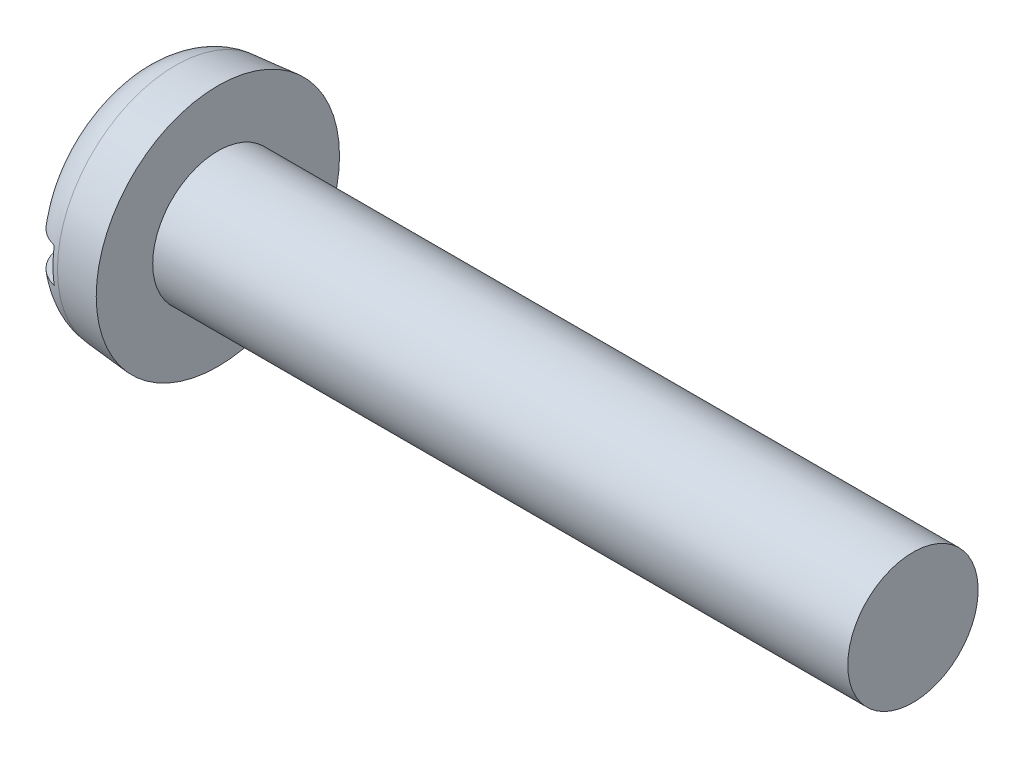
ISO-10303-21;
HEADER;
FILE_DESCRIPTION(('STEP AP214'),'2;1');
FILE_NAME('part.step','',(''),(''),'','','');
FILE_SCHEMA(('AUTOMOTIVE_DESIGN { 1 0 10303 214 1 1 1 1 }'));
ENDSEC;
DATA;
#1=APPLICATION_CONTEXT('core data for automotive mechanical design processes');
#2=APPLICATION_PROTOCOL_DEFINITION('international standard','automotive_design',2000,#1);
#3=PRODUCT_CONTEXT('',#1,'mechanical');
#4=PRODUCT('Part','Part','',(#3));
#5=PRODUCT_RELATED_PRODUCT_CATEGORY('part','',(#4));
#6=PRODUCT_DEFINITION_FORMATION('','',#4);
#7=PRODUCT_DEFINITION_CONTEXT('part definition',#1,'design');
#8=PRODUCT_DEFINITION('design','',#6,#7);
#9=PRODUCT_DEFINITION_SHAPE('','',#8);
#10=(LENGTH_UNIT() NAMED_UNIT(*) SI_UNIT(.MILLI.,.METRE.));
#11=(NAMED_UNIT(*) PLANE_ANGLE_UNIT() SI_UNIT($,.RADIAN.));
#12=(NAMED_UNIT(*) SI_UNIT($,.STERADIAN.) SOLID_ANGLE_UNIT());
#13=UNCERTAINTY_MEASURE_WITH_UNIT(LENGTH_MEASURE(1.E-05),#10,'distance_accuracy_value','');
#14=(GEOMETRIC_REPRESENTATION_CONTEXT(3) GLOBAL_UNCERTAINTY_ASSIGNED_CONTEXT((#13)) GLOBAL_UNIT_ASSIGNED_CONTEXT((#10,
#11,#12)) REPRESENTATION_CONTEXT('',''));
#15=CARTESIAN_POINT('',(0.,0.,0.));
#16=DIRECTION('',(0.,0.,1.));
#17=DIRECTION('',(1.,0.,0.));
#18=AXIS2_PLACEMENT_3D('',#15,#16,#17);
#19=CARTESIAN_POINT('',(0.,0.,0.));
#20=DIRECTION('',(-1.,0.,0.));
#21=DIRECTION('',(0.,0.,1.));
#22=AXIS2_PLACEMENT_3D('',#19,#20,#21);
#23=PLANE('',#22);
#24=DIRECTION('',(0.,0.,-1.));
#25=VECTOR('',#24,1.);
#26=CARTESIAN_POINT('',(0.,0.4,2.8));
#27=LINE('',#26,#25);
#28=CARTESIAN_POINT('',(0.,0.4,1.77326763142532));
#29=VERTEX_POINT('',#28);
#30=CARTESIAN_POINT('',(0.,0.4,-1.77326763142532));
#31=VERTEX_POINT('',#30);
#32=EDGE_CURVE('E88',#29,#31,#27,.T.);
#33=ORIENTED_EDGE('',*,*,#32,.F.);
#34=CARTESIAN_POINT('',(0.,0.,0.));
#35=DIRECTION('',(-1.,0.,0.));
#36=DIRECTION('',(0.,0.,1.));
#37=AXIS2_PLACEMENT_3D('',#34,#35,#36);
#38=CIRCLE('',#37,1.81782234903766);
#39=EDGE_CURVE('E94',#29,#31,#38,.T.);
#40=ORIENTED_EDGE('',*,*,#39,.T.);
#41=EDGE_LOOP('',(#33,#40));
#42=FACE_BOUND('',#41,.T.);
#43=ADVANCED_FACE('F35',(#42),#23,.T.);
#44=CARTESIAN_POINT('',(-25.4,0.,0.));
#45=DIRECTION('',(-1.,0.,0.));
#46=DIRECTION('',(0.,0.,1.));
#47=AXIS2_PLACEMENT_3D('',#44,#45,#46);
#48=CYLINDRICAL_SURFACE('',#47,1.5);
#49=CARTESIAN_POINT('',(17.8,0.,0.));
#50=DIRECTION('',(-1.,0.,0.));
#51=DIRECTION('',(0.,0.,1.));
#52=AXIS2_PLACEMENT_3D('',#49,#50,#51);
#53=CIRCLE('',#52,1.5);
#54=CARTESIAN_POINT('',(17.8,0.,1.5));
#55=VERTEX_POINT('',#54);
#56=EDGE_CURVE('E95',#55,#55,#53,.T.);
#57=ORIENTED_EDGE('',*,*,#56,.T.);
#58=EDGE_LOOP('',(#57));
#59=FACE_BOUND('',#58,.T.);
#60=CARTESIAN_POINT('',(1.8,0.,0.));
#61=DIRECTION('',(-1.,0.,0.));
#62=DIRECTION('',(0.,0.,1.));
#63=AXIS2_PLACEMENT_3D('',#60,#61,#62);
#64=CIRCLE('',#63,1.5);
#65=CARTESIAN_POINT('',(1.8,0.,1.5));
#66=VERTEX_POINT('',#65);
#67=EDGE_CURVE('E152',#66,#66,#64,.T.);
#68=ORIENTED_EDGE('',*,*,#67,.F.);
#69=EDGE_LOOP('',(#68));
#70=FACE_BOUND('',#69,.T.);
#71=ADVANCED_FACE('F140',(#59,#70),#48,.T.);
#72=CARTESIAN_POINT('',(17.8,1.5,0.));
#73=DIRECTION('',(1.,0.,0.));
#74=DIRECTION('',(0.,0.,-1.));
#75=AXIS2_PLACEMENT_3D('',#72,#73,#74);
#76=PLANE('',#75);
#77=ORIENTED_EDGE('',*,*,#56,.F.);
#78=EDGE_LOOP('',(#77));
#79=FACE_BOUND('',#78,.T.);
#80=ADVANCED_FACE('F138',(#79),#76,.T.);
#81=DIRECTION('',(0.,0.,1.));
#82=VECTOR('',#81,1.);
#83=CARTESIAN_POINT('',(0.,-0.4,-2.8));
#84=LINE('',#83,#82);
#85=CARTESIAN_POINT('',(0.,-0.4,-1.77326763142532));
#86=VERTEX_POINT('',#85);
#87=CARTESIAN_POINT('',(0.,-0.4,1.77326763142532));
#88=VERTEX_POINT('',#87);
#89=EDGE_CURVE('E79',#86,#88,#84,.T.);
#90=ORIENTED_EDGE('',*,*,#89,.F.);
#91=EDGE_CURVE('E86',#86,#88,#38,.T.);
#92=ORIENTED_EDGE('',*,*,#91,.T.);
#93=EDGE_LOOP('',(#90,#92));
#94=FACE_BOUND('',#93,.T.);
#95=ADVANCED_FACE('F85',(#94),#23,.T.);
#96=CARTESIAN_POINT('',(0.,0.,0.));
#97=DIRECTION('',(1.,0.,0.));
#98=DIRECTION('',(0.,0.,-1.));
#99=AXIS2_PLACEMENT_3D('',#96,#97,#98);
#100=CONICAL_SURFACE('',#99,2.64252040565334,0.0872664625997168);
#101=CARTESIAN_POINT('',(0.821559831527111,0.,0.));
#102=DIRECTION('',(-1.,0.,0.));
#103=DIRECTION('',(0.,0.,1.));
#104=AXIS2_PLACEMENT_3D('',#101,#102,#103);
#105=CIRCLE('',#104,2.71439757732023);
#106=CARTESIAN_POINT('',(0.821559831527111,0.,2.71439757732023));
#107=VERTEX_POINT('',#106);
#108=EDGE_CURVE('E98',#107,#107,#105,.F.);
#109=ORIENTED_EDGE('',*,*,#108,.T.);
#110=EDGE_LOOP('',(#109));
#111=FACE_BOUND('',#110,.T.);
#112=CARTESIAN_POINT('',(1.8,0.,0.));
#113=DIRECTION('',(-1.,0.,0.));
#114=DIRECTION('',(0.,0.,1.));
#115=AXIS2_PLACEMENT_3D('',#112,#113,#114);
#116=CIRCLE('',#115,2.8);
#117=CARTESIAN_POINT('',(1.8,0.,2.8));
#118=VERTEX_POINT('',#117);
#119=EDGE_CURVE('E100',#118,#118,#116,.T.);
#120=ORIENTED_EDGE('',*,*,#119,.T.);
#121=EDGE_LOOP('',(#120));
#122=FACE_BOUND('',#121,.T.);
#123=ADVANCED_FACE('F131',(#111,#122),#100,.T.);
#124=CARTESIAN_POINT('',(1.8,1.5,0.));
#125=DIRECTION('',(-1.,0.,0.));
#126=DIRECTION('',(0.,0.,1.));
#127=AXIS2_PLACEMENT_3D('',#124,#125,#126);
#128=PLANE('',#127);
#129=ORIENTED_EDGE('',*,*,#119,.F.);
#130=EDGE_LOOP('',(#129));
#131=FACE_BOUND('',#130,.T.);
#132=ORIENTED_EDGE('',*,*,#67,.T.);
#133=EDGE_LOOP('',(#132));
#134=FACE_BOUND('',#133,.T.);
#135=ADVANCED_FACE('F127',(#131,#134),#128,.F.);
#136=CARTESIAN_POINT('',(0.9,0.,0.));
#137=DIRECTION('',(-1.,0.,0.));
#138=DIRECTION('',(0.,0.,1.));
#139=AXIS2_PLACEMENT_3D('',#136,#137,#138);
#140=TOROIDAL_SURFACE('',#139,1.81782234903766,0.9);
#141=CARTESIAN_POINT('',(0.401696093511728,0.4,-2.53593152114129));
#142=CARTESIAN_POINT('',(0.443301117774009,0.4,-2.56393332788218));
#143=CARTESIAN_POINT('',(0.48728921147468,0.4,-2.58845843023252));
#144=CARTESIAN_POINT('',(0.578792425576941,0.4,-2.62980192456992));
#145=CARTESIAN_POINT('',(0.626311517541325,0.4,-2.64661148109401));
#146=CARTESIAN_POINT('',(0.723491694345221,0.4,-2.67199528317045));
#147=CARTESIAN_POINT('',(0.77315217005018,0.4,-2.6805718547261));
#148=CARTESIAN_POINT('',(0.873195470603058,0.4,-2.68923740018578));
#149=CARTESIAN_POINT('',(0.923578118909892,0.4,-2.68932841422142));
#150=CARTESIAN_POINT('',(1.02350797374872,0.4,-2.68103738118982));
#151=CARTESIAN_POINT('',(1.07305702227845,0.4,-2.67267751789981));
#152=CARTESIAN_POINT('',(1.17005159771854,0.4,-2.64776531442094));
#153=CARTESIAN_POINT('',(1.21749706154432,0.4,-2.63121272872072));
#154=CARTESIAN_POINT('',(1.30899463227735,0.4,-2.59038229907007));
#155=CARTESIAN_POINT('',(1.35304326494453,0.4,-2.5660966726896));
#156=CARTESIAN_POINT('',(1.43646971838795,0.4,-2.51051742624853));
#157=CARTESIAN_POINT('',(1.47584746170715,0.4,-2.47922368999777));
#158=CARTESIAN_POINT('',(1.54908472891299,0.4,-2.41032419236434));
#159=CARTESIAN_POINT('',(1.58290894495081,0.4,-2.37268091273685));
#160=CARTESIAN_POINT('',(1.64384285536696,0.4,-2.29230689336045));
#161=CARTESIAN_POINT('',(1.67095227126419,0.4,-2.24957594272072));
#162=CARTESIAN_POINT('',(1.71804431058735,0.4,-2.15971237578418));
#163=CARTESIAN_POINT('',(1.73793948776457,0.4,-2.11253395536871));
#164=CARTESIAN_POINT('',(1.76968090770725,0.4,-2.01554593245493));
#165=CARTESIAN_POINT('',(1.78152655521718,0.4,-1.96573613566218));
#166=CARTESIAN_POINT('',(1.79707863209083,0.4,-1.86394560462762));
#167=CARTESIAN_POINT('',(1.80063474217523,0.4,-1.81194193297292));
#168=CARTESIAN_POINT('',(1.79917918253395,0.4,-1.70805700113295));
#169=CARTESIAN_POINT('',(1.79416652473772,0.4,-1.65617575575555));
#170=CARTESIAN_POINT('',(1.7755943642346,0.4,-1.55269446133053));
#171=CARTESIAN_POINT('',(1.76183474132893,0.4,-1.50113034177219));
#172=CARTESIAN_POINT('',(1.72605722331735,0.4,-1.40095096381718));
#173=CARTESIAN_POINT('',(1.70403814128862,0.4,-1.35233613041373));
#174=CARTESIAN_POINT('',(1.65177086981811,0.4,-1.25824022538735));
#175=CARTESIAN_POINT('',(1.62134113345016,0.4,-1.21285988807693));
#176=CARTESIAN_POINT('',(1.55331109595649,0.4,-1.12780932458797));
#177=CARTESIAN_POINT('',(1.51570875984687,0.4,-1.08814072454133));
#178=CARTESIAN_POINT('',(1.43418773757712,0.4,-1.01571120097083));
#179=CARTESIAN_POINT('',(1.39025557046043,0.4,-0.982965398150426));
#180=CARTESIAN_POINT('',(1.29725173640542,0.4,-0.925820211344956));
#181=CARTESIAN_POINT('',(1.24818246394632,0.4,-0.901416961201436));
#182=CARTESIAN_POINT('',(1.1492196326343,0.4,-0.863395366502829));
#183=CARTESIAN_POINT('',(1.09953332116632,0.4,-0.849240526280142));
#184=CARTESIAN_POINT('',(0.998407326739823,0.4,-0.830450847570662));
#185=CARTESIAN_POINT('',(0.946969290105793,0.4,-0.825807308120568));
#186=CARTESIAN_POINT('',(0.84892872096548,0.4,-0.826338661096803));
#187=CARTESIAN_POINT('',(0.802319233875119,0.4,-0.830644672645143));
#188=CARTESIAN_POINT('',(0.710503550748047,0.4,-0.847082675101284));
#189=CARTESIAN_POINT('',(0.665297586491216,0.4,-0.859215951485934));
#190=CARTESIAN_POINT('',(0.577725921687515,0.4,-0.890561229701253));
#191=CARTESIAN_POINT('',(0.535345451357801,0.4,-0.909732336345551));
#192=CARTESIAN_POINT('',(0.454039585142496,0.4,-0.954356114786257));
#193=CARTESIAN_POINT('',(0.415115190169609,0.4,-0.979810598293163));
#194=CARTESIAN_POINT('',(0.338258283652574,0.4,-1.03863563377017));
#195=CARTESIAN_POINT('',(0.300704584388947,0.4,-1.07250127234658));
#196=CARTESIAN_POINT('',(0.231340396591253,0.4,-1.14567873524743));
#197=CARTESIAN_POINT('',(0.199531837361427,0.4,-1.1849923812911));
#198=CARTESIAN_POINT('',(0.140343537062657,0.4,-1.27100479329441));
#199=CARTESIAN_POINT('',(0.113435239263175,0.4,-1.31802904125808));
#200=CARTESIAN_POINT('',(0.0677697881199934,0.4,-1.41588613859262));
#201=CARTESIAN_POINT('',(0.0490135480549559,0.4,-1.466719413943));
#202=CARTESIAN_POINT('',(0.0200605085740848,0.4,-1.57150752749652));
#203=CARTESIAN_POINT('',(0.00998112078324489,0.4,-1.62549494001755));
#204=CARTESIAN_POINT('',(-0.000774459474645484,0.4,-1.73439964710515));
#205=CARTESIAN_POINT('',(-0.00145178031293717,0.4,-1.78931682929512));
#206=CARTESIAN_POINT('',(0.00665978805998371,0.4,-1.8973585349181));
#207=CARTESIAN_POINT('',(0.0152619165789972,0.4,-1.95049703954292));
#208=CARTESIAN_POINT('',(0.0415044362784365,0.4,-2.05451158025993));
#209=CARTESIAN_POINT('',(0.0591459771853456,0.4,-2.10538732765632));
#210=CARTESIAN_POINT('',(0.102479617855353,0.4,-2.20207106255329));
#211=CARTESIAN_POINT('',(0.127962009730159,0.4,-2.24797321246302));
#212=CARTESIAN_POINT('',(0.186405952526769,0.4,-2.3346826673761));
#213=CARTESIAN_POINT('',(0.219357119954585,0.4,-2.37549692488183));
#214=CARTESIAN_POINT('',(0.2776517991716,0.4,-2.43611780517026));
#215=CARTESIAN_POINT('',(0.300961246504243,0.4,-2.45791602542563));
#216=CARTESIAN_POINT('',(0.349758108963351,0.4,-2.49892172941219));
#217=CARTESIAN_POINT('',(0.375245501851939,0.4,-2.51812923959063));
#218=CARTESIAN_POINT('',(0.401696093511728,0.4,-2.53593152114129));
#219=B_SPLINE_CURVE_WITH_KNOTS('',3,(#141,#142,#143,#144,#145,#146,#147,#148,#149,#150,#151,
#152,#153,#154,#155,#156,#157,#158,#159,#160,#161,#162,#163,#164,#165,#166,#167,#168,#169,#170,
#171,#172,#173,#174,#175,#176,#177,#178,#179,#180,#181,#182,#183,#184,#185,#186,#187,#188,#189,
#190,#191,#192,#193,#194,#195,#196,#197,#198,#199,#200,#201,#202,#203,#204,#205,#206,#207,#208,
#209,#210,#211,#212,#213,#214,#215,#216,#217,#218),.UNSPECIFIED.,.T.,.F.,(4,2,2,2,2,2,2,2,2,2,2,
2,2,2,2,2,2,2,2,2,2,2,2,2,2,2,2,2,2,2,2,2,2,2,2,2,2,2,4),(0.,0.150335933494514,
0.300843597394242,0.451308726970357,0.601737681026104,0.751772777865598,0.901812371080131,
1.05200344195132,1.20219700308282,1.35331128753966,1.50443183806961,1.65732734739064,
1.81023416196794,1.96589285940572,2.1215695071664,2.28094272743601,2.44033885916066,
2.60348795607714,2.76668341009569,2.93023171311279,3.09370412047096,3.24783730341248,
3.40182942181944,3.5415702699926,3.68133407374162,3.82029827564248,3.95930259253055,
4.11036263383425,4.26147330942957,4.42325618279747,4.58505717610391,4.74901464634026,
4.9129524393615,5.07365129317271,5.23437059141101,5.39111839087745,5.54764959339694,
5.64322735248863,5.73880413580184),.UNSPECIFIED.);
#220=CARTESIAN_POINT('',(0.7,0.4,-2.66547244738019));
#221=VERTEX_POINT('',#220);
#222=EDGE_CURVE('E11',#31,#221,#219,.T.);
#223=ORIENTED_EDGE('',*,*,#222,.F.);
#224=ORIENTED_EDGE('',*,*,#39,.F.);
#225=CARTESIAN_POINT('',(0.631175220468883,0.4,0.871495981540627));
#226=CARTESIAN_POINT('',(0.674904543341188,0.4,0.856438796500031));
#227=CARTESIAN_POINT('',(0.719878263159747,0.4,0.844929838444239));
#228=CARTESIAN_POINT('',(0.811135722097473,0.4,0.829645582358335));
#229=CARTESIAN_POINT('',(0.857419653490011,0.4,0.82587142543657));
#230=CARTESIAN_POINT('',(0.949967657712768,0.4,0.826292946243278));
#231=CARTESIAN_POINT('',(0.996231718998188,0.4,0.830491246695725));
#232=CARTESIAN_POINT('',(1.08739120729822,0.4,0.846603737630664));
#233=CARTESIAN_POINT('',(1.13228633060722,0.4,0.858519627443414));
#234=CARTESIAN_POINT('',(1.21961165117638,0.4,0.889449471124122));
#235=CARTESIAN_POINT('',(1.26203829733493,0.4,0.908473372222466));
#236=CARTESIAN_POINT('',(1.34345634110222,0.4,0.952815473313927));
#237=CARTESIAN_POINT('',(1.38244667242382,0.4,0.978135617780085));
#238=CARTESIAN_POINT('',(1.4594377621541,0.4,1.03667706350997));
#239=CARTESIAN_POINT('',(1.49706398720202,0.4,1.07039108297028));
#240=CARTESIAN_POINT('',(1.56659895295035,0.4,1.14327535241885));
#241=CARTESIAN_POINT('',(1.59850581805068,0.4,1.18244738484377));
#242=CARTESIAN_POINT('',(1.65794109406934,0.4,1.26820361081833));
#243=CARTESIAN_POINT('',(1.68499616118368,0.4,1.31511693869777));
#244=CARTESIAN_POINT('',(1.73097615311023,0.4,1.41277630231542));
#245=CARTESIAN_POINT('',(1.74990014079754,0.4,1.46352277904048));
#246=CARTESIAN_POINT('',(1.77921631303595,0.4,1.56819037296415));
#247=CARTESIAN_POINT('',(1.78948692404479,0.4,1.62214568122431));
#248=CARTESIAN_POINT('',(1.80062989577949,0.4,1.73102148257415));
#249=CARTESIAN_POINT('',(1.80150300404476,0.4,1.78594189854469));
#250=CARTESIAN_POINT('',(1.79377570144154,0.4,1.89403950300678));
#251=CARTESIAN_POINT('',(1.78535947623962,0.4,1.94722981003804));
#252=CARTESIAN_POINT('',(1.75948035152466,0.4,2.05136420293336));
#253=CARTESIAN_POINT('',(1.74201866082191,0.4,2.10230858794919));
#254=CARTESIAN_POINT('',(1.69903294428936,0.4,2.1991365537311));
#255=CARTESIAN_POINT('',(1.67372338322898,0.4,2.24511537218269));
#256=CARTESIAN_POINT('',(1.61559302758182,0.4,2.33205182310155));
#257=CARTESIAN_POINT('',(1.58277310246186,0.4,2.37301003595672));
#258=CARTESIAN_POINT('',(1.51127974813898,0.4,2.44787841079591));
#259=CARTESIAN_POINT('',(1.47273752290481,0.4,2.48191390856888));
#260=CARTESIAN_POINT('',(1.39041996071933,0.4,2.54292499319193));
#261=CARTESIAN_POINT('',(1.34664504043414,0.4,2.5699011416151));
#262=CARTESIAN_POINT('',(1.25574182443869,0.4,2.61566191750627));
#263=CARTESIAN_POINT('',(1.20866632391598,0.4,2.63455146707593));
#264=CARTESIAN_POINT('',(1.11199802813735,0.4,2.66409285611721));
#265=CARTESIAN_POINT('',(1.06240535215686,0.4,2.67474508552361));
#266=CARTESIAN_POINT('',(0.962502526653357,0.4,2.68744471269732));
#267=CARTESIAN_POINT('',(0.912200346253432,0.4,2.68955487726819));
#268=CARTESIAN_POINT('',(0.811958811975336,0.4,2.68528081529453));
#269=CARTESIAN_POINT('',(0.762019450666034,0.4,2.67889676322146));
#270=CARTESIAN_POINT('',(0.664027531989639,0.4,2.65784627208927));
#271=CARTESIAN_POINT('',(0.615971279375599,0.4,2.643197022474));
#272=CARTESIAN_POINT('',(0.522990210676872,0.4,2.60606123058607));
#273=CARTESIAN_POINT('',(0.478065406672589,0.4,2.58357465808084));
#274=CARTESIAN_POINT('',(0.392472109536808,0.4,2.53134616302211));
#275=CARTESIAN_POINT('',(0.351816515703728,0.4,2.50158310815031));
#276=CARTESIAN_POINT('',(0.276029509997113,0.4,2.4357048513604));
#277=CARTESIAN_POINT('',(0.240898244430083,0.4,2.39958948126101));
#278=CARTESIAN_POINT('',(0.176835333350468,0.4,2.32172709740984));
#279=CARTESIAN_POINT('',(0.147956836829552,0.4,2.27993636985612));
#280=CARTESIAN_POINT('',(0.0975151321071609,0.4,2.19215427977415));
#281=CARTESIAN_POINT('',(0.0759523258739369,0.4,2.14616268660111));
#282=CARTESIAN_POINT('',(0.0404117526562702,0.4,2.05060031814039));
#283=CARTESIAN_POINT('',(0.0265449840419457,0.4,2.00098828619734));
#284=CARTESIAN_POINT('',(0.00715737687929584,0.4,1.90016214005584));
#285=CARTESIAN_POINT('',(0.00163730520276083,0.4,1.84894787909014));
#286=CARTESIAN_POINT('',(-0.00103646856464831,0.4,1.74525626284435));
#287=CARTESIAN_POINT('',(0.00198298502720431,0.4,1.692774471539));
#288=CARTESIAN_POINT('',(0.0165672576861163,0.4,1.5890162459782));
#289=CARTESIAN_POINT('',(0.0281327748436754,0.4,1.53773991054426));
#290=CARTESIAN_POINT('',(0.0597928723844844,0.4,1.43649219995258));
#291=CARTESIAN_POINT('',(0.0800919231210289,0.4,1.3865847552086));
#292=CARTESIAN_POINT('',(0.128628670781471,0.4,1.29076759544655));
#293=CARTESIAN_POINT('',(0.156870001205797,0.4,1.2448597228063));
#294=CARTESIAN_POINT('',(0.221149361739103,0.4,1.15746425330815));
#295=CARTESIAN_POINT('',(0.257329693538453,0.4,1.11608124200677));
#296=CARTESIAN_POINT('',(0.33619903186313,0.4,1.04011285475969));
#297=CARTESIAN_POINT('',(0.378880772489415,0.4,1.00551998779309));
#298=CARTESIAN_POINT('',(0.456345744826249,0.4,0.953377181098868));
#299=CARTESIAN_POINT('',(0.489781510585734,0.4,0.933802963989649));
#300=CARTESIAN_POINT('',(0.558913558209207,0.4,0.899158166013482));
#301=CARTESIAN_POINT('',(0.594609343085406,0.4,0.884086599134742));
#302=CARTESIAN_POINT('',(0.631175220468883,0.4,0.871495981540627));
#303=B_SPLINE_CURVE_WITH_KNOTS('',3,(#225,#226,#227,#228,#229,#230,#231,#232,#233,#234,#235,
#236,#237,#238,#239,#240,#241,#242,#243,#244,#245,#246,#247,#248,#249,#250,#251,#252,#253,#254,
#255,#256,#257,#258,#259,#260,#261,#262,#263,#264,#265,#266,#267,#268,#269,#270,#271,#272,#273,
#274,#275,#276,#277,#278,#279,#280,#281,#282,#283,#284,#285,#286,#287,#288,#289,#290,#291,#292,
#293,#294,#295,#296,#297,#298,#299,#300,#301,#302),.UNSPECIFIED.,.T.,.F.,(4,2,2,2,2,2,2,2,2,2,2,
2,2,2,2,2,2,2,2,2,2,2,2,2,2,2,2,2,2,2,2,2,2,2,2,2,2,2,4),(0.,0.138615612916103,
0.277251674198893,0.415933350916858,0.554645574236207,0.693552648422647,0.832502674767945,
0.983421485118331,1.13438969741741,1.29610427307938,1.45783748170807,1.62180673071881,
1.78576293643649,1.94652574714201,2.10726707950299,2.2639540446038,2.42062287939072,
2.57413636036031,2.72763762557716,2.87908198292273,3.03051917082038,3.18084156107108,
3.33116086374289,3.4811686879926,3.63117709090574,3.78162643331956,3.93207975956823,
4.08376569017546,4.23545995397545,4.38928870771081,4.54313159395465,4.70011617891189,
4.85711358867004,5.01800577434983,5.17897168640495,5.34310060642745,5.50704742574204,
5.62298136153755,5.73888989092701),.UNSPECIFIED.);
#304=CARTESIAN_POINT('',(0.7,0.4,2.66547244738019));
#305=VERTEX_POINT('',#304);
#306=EDGE_CURVE('E112',#305,#29,#303,.T.);
#307=ORIENTED_EDGE('',*,*,#306,.F.);
#308=CARTESIAN_POINT('',(0.7,0.,0.));
#309=DIRECTION('',(-1.,0.,0.));
#310=DIRECTION('',(0.,0.,1.));
#311=AXIS2_PLACEMENT_3D('',#308,#309,#310);
#312=CIRCLE('',#311,2.69531878777687);
#313=CARTESIAN_POINT('',(0.7,-0.4,2.66547244738019));
#314=VERTEX_POINT('',#313);
#315=EDGE_CURVE('E106',#305,#314,#312,.F.);
#316=ORIENTED_EDGE('',*,*,#315,.T.);
#317=CARTESIAN_POINT('',(0.631175220468883,-0.4,0.871495981540627));
#318=CARTESIAN_POINT('',(0.582440056051627,-0.4,0.888281741940888));
#319=CARTESIAN_POINT('',(0.535174963055644,-0.4,0.909503716497946));
#320=CARTESIAN_POINT('',(0.444903467512748,-0.4,0.959728629210835));
#321=CARTESIAN_POINT('',(0.401907569369314,-0.4,0.988750138784298));
#322=CARTESIAN_POINT('',(0.32139933187422,-0.4,1.05330679583531));
#323=CARTESIAN_POINT('',(0.283866824101226,-0.4,1.08881683540862));
#324=CARTESIAN_POINT('',(0.214947035166147,-0.4,1.16532583126717));
#325=CARTESIAN_POINT('',(0.183557026279774,-0.4,1.20632233747312));
#326=CARTESIAN_POINT('',(0.126173306630207,-0.4,1.29499806178717));
#327=CARTESIAN_POINT('',(0.100543812186154,-0.4,1.34291357063032));
#328=CARTESIAN_POINT('',(0.0575990442880277,-0.4,1.44234685085245));
#329=CARTESIAN_POINT('',(0.0402853165841816,-0.4,1.4938652899135));
#330=CARTESIAN_POINT('',(0.0144295468099868,-0.4,1.59957722380881));
#331=CARTESIAN_POINT('',(0.00597091020770669,-0.4,1.65379120331088));
#332=CARTESIAN_POINT('',(-0.00151505119498231,-0.4,1.76286943896087));
#333=CARTESIAN_POINT('',(-0.000543260661566268,-0.4,1.81773363362998));
#334=CARTESIAN_POINT('',(0.0108063117868816,-0.4,1.92531903415647));
#335=CARTESIAN_POINT('',(0.0209864254781905,-0.4,1.97806105250491));
#336=CARTESIAN_POINT('',(0.0502872770681116,-0.4,2.08100191154855));
#337=CARTESIAN_POINT('',(0.0694067748926924,-0.4,2.13120110391516));
#338=CARTESIAN_POINT('',(0.115513806824551,-0.4,2.22629801812597));
#339=CARTESIAN_POINT('',(0.14229288611334,-0.4,2.27129684027619));
#340=CARTESIAN_POINT('',(0.203167661896693,-0.4,2.35603997582291));
#341=CARTESIAN_POINT('',(0.237262555060448,-0.4,2.39578486536653));
#342=CARTESIAN_POINT('',(0.31107215015185,-0.4,2.46808210682477));
#343=CARTESIAN_POINT('',(0.350664393955093,-0.4,2.50075952492731));
#344=CARTESIAN_POINT('',(0.43483240572609,-0.4,2.55890052234819));
#345=CARTESIAN_POINT('',(0.479407789016665,-0.4,2.5843646579657));
#346=CARTESIAN_POINT('',(0.571659032279254,-0.4,2.62702917155574));
#347=CARTESIAN_POINT('',(0.61928802255602,-0.4,2.64433093880064));
#348=CARTESIAN_POINT('',(0.716785744822632,-0.4,2.67063086398603));
#349=CARTESIAN_POINT('',(0.766654377625563,-0.4,2.67962938927216));
#350=CARTESIAN_POINT('',(0.866851086765478,-0.4,2.68902063968356));
#351=CARTESIAN_POINT('',(0.917173710289189,-0.4,2.68947163706794));
#352=CARTESIAN_POINT('',(1.01717730229027,-0.4,2.68190382365889));
#353=CARTESIAN_POINT('',(1.06685828235616,-0.4,2.67388516605054));
#354=CARTESIAN_POINT('',(1.16408913364714,-0.4,2.64963561785688));
#355=CARTESIAN_POINT('',(1.21164224901621,-0.4,2.63341772685543));
#356=CARTESIAN_POINT('',(1.30336357324319,-0.4,2.5932548985632));
#357=CARTESIAN_POINT('',(1.34753176252252,-0.4,2.56930991658271));
#358=CARTESIAN_POINT('',(1.43140121230963,-0.4,2.51429882511239));
#359=CARTESIAN_POINT('',(1.47108662202344,-0.4,2.48320855787322));
#360=CARTESIAN_POINT('',(1.54472936336671,-0.4,2.41485918396244));
#361=CARTESIAN_POINT('',(1.57868652408327,-0.4,2.37759989329229));
#362=CARTESIAN_POINT('',(1.64024044205203,-0.4,2.29763356977095));
#363=CARTESIAN_POINT('',(1.66777905671271,-0.4,2.2548817982485));
#364=CARTESIAN_POINT('',(1.71540533966796,-0.4,2.16541487025925));
#365=CARTESIAN_POINT('',(1.73549258796614,-0.4,2.11869949056591));
#366=CARTESIAN_POINT('',(1.76797944190081,-0.4,2.02190542768205));
#367=CARTESIAN_POINT('',(1.78026184844694,-0.4,1.97178743470805));
#368=CARTESIAN_POINT('',(1.79642443017794,-0.4,1.87021727726405));
#369=CARTESIAN_POINT('',(1.80030382576996,-0.4,1.81876498945237));
#370=CARTESIAN_POINT('',(1.79965225810416,-0.4,1.71483495243173));
#371=CARTESIAN_POINT('',(1.79494304519989,-0.4,1.66235834857244));
#372=CARTESIAN_POINT('',(1.77700429154566,-0.4,1.55888409709202));
#373=CARTESIAN_POINT('',(1.76377367047763,-0.4,1.50788663784912));
#374=CARTESIAN_POINT('',(1.72880303252309,-0.4,1.40746214507163));
#375=CARTESIAN_POINT('',(1.7068583172022,-0.4,1.35810636780321));
#376=CARTESIAN_POINT('',(1.6551362081094,-0.4,1.2636760290119));
#377=CARTESIAN_POINT('',(1.62535713115486,-0.4,1.21860239032601));
#378=CARTESIAN_POINT('',(1.55817582249343,-0.4,1.13325277423327));
#379=CARTESIAN_POINT('',(1.52065002148733,-0.4,1.09307386688499));
#380=CARTESIAN_POINT('',(1.43925099604233,-0.4,1.01972901550195));
#381=CARTESIAN_POINT('',(1.39537733695676,-0.4,0.986563552070545));
#382=CARTESIAN_POINT('',(1.30343025383384,-0.4,0.929222350042134));
#383=CARTESIAN_POINT('',(1.25547156560025,-0.4,0.904863533629853));
#384=CARTESIAN_POINT('',(1.15587516450286,-0.4,0.865408006374134));
#385=CARTESIAN_POINT('',(1.10423998181313,-0.4,0.850304993129927));
#386=CARTESIAN_POINT('',(1.00351728354306,-0.4,0.831235729727251));
#387=CARTESIAN_POINT('',(0.954588162116058,-0.4,0.826429393731615));
#388=CARTESIAN_POINT('',(0.856720563885967,-0.4,0.825757597618513));
#389=CARTESIAN_POINT('',(0.80778225521716,-0.4,0.8298764112406));
#390=CARTESIAN_POINT('',(0.737839755845568,-0.4,0.842103164129609));
#391=CARTESIAN_POINT('',(0.716186869313665,-0.4,0.846800488735406));
#392=CARTESIAN_POINT('',(0.673323995455611,-0.4,0.857891117601622));
#393=CARTESIAN_POINT('',(0.652113925657395,-0.4,0.86428410295996));
#394=CARTESIAN_POINT('',(0.631175220468883,-0.4,0.871495981540627));
#395=B_SPLINE_CURVE_WITH_KNOTS('',3,(#317,#318,#319,#320,#321,#322,#323,#324,#325,#326,#327,
#328,#329,#330,#331,#332,#333,#334,#335,#336,#337,#338,#339,#340,#341,#342,#343,#344,#345,#346,
#347,#348,#349,#350,#351,#352,#353,#354,#355,#356,#357,#358,#359,#360,#361,#362,#363,#364,#365,
#366,#367,#368,#369,#370,#371,#372,#373,#374,#375,#376,#377,#378,#379,#380,#381,#382,#383,#384,
#385,#386,#387,#388,#389,#390,#391,#392,#393,#394),.UNSPECIFIED.,.T.,.F.,(4,2,2,2,2,2,2,2,2,2,2,
2,2,2,2,2,2,2,2,2,2,2,2,2,2,2,2,2,2,2,2,2,2,2,2,2,2,2,4),(0.,0.154545929505514,
0.309463158544145,0.463793151236126,0.618054453677577,0.780314715588444,0.942605127077751,
1.10641075199289,1.27020101048904,1.43055663497239,1.59089002147255,1.74721863073234,
1.90353008272413,2.05679554725431,2.2100491885017,2.3613455070347,2.51263513171131,
2.66289297461213,2.81314809994484,2.96316574487772,3.11318425745476,3.26371763526343,
3.41425550371989,3.56610818035137,3.71796941486144,3.87206025933959,4.02616539904814,
4.18350533199931,4.3408652159535,4.50216376271748,4.66349699219782,4.82763600715278,
4.99178626625811,5.15229563882414,5.31269559661531,5.45941323508264,5.6058725648985,
5.67228456882568,5.73868409152545),.UNSPECIFIED.);
#396=EDGE_CURVE('E93',#88,#314,#395,.T.);
#397=ORIENTED_EDGE('',*,*,#396,.F.);
#398=ORIENTED_EDGE('',*,*,#91,.F.);
#399=CARTESIAN_POINT('',(0.401696093511728,-0.4,-2.53593152114129));
#400=CARTESIAN_POINT('',(0.359499569861718,-0.4,-2.50752594853869));
#401=CARTESIAN_POINT('',(0.319690458635452,-0.4,-2.47549983982046));
#402=CARTESIAN_POINT('',(0.246006645656666,-0.4,-2.40516587836491));
#403=CARTESIAN_POINT('',(0.212140132740978,-0.4,-2.36684949616946));
#404=CARTESIAN_POINT('',(0.151336229791143,-0.4,-2.28512812362888));
#405=CARTESIAN_POINT('',(0.124391330893495,-0.4,-2.24172872264131));
#406=CARTESIAN_POINT('',(0.0780875903765085,-0.4,-2.15107708021563));
#407=CARTESIAN_POINT('',(0.0587267801703001,-0.4,-2.10382584244335));
#408=CARTESIAN_POINT('',(0.0278574989581019,-0.4,-2.00623443962711));
#409=CARTESIAN_POINT('',(0.016440901453291,-0.4,-1.95586524023863));
#410=CARTESIAN_POINT('',(0.00203581031766626,-0.4,-1.85393618870856));
#411=CARTESIAN_POINT('',(-0.000951523403916868,-0.4,-1.80237617368877));
#412=CARTESIAN_POINT('',(0.00150541182221353,-0.4,-1.69835894015113));
#413=CARTESIAN_POINT('',(0.00713078743956859,-0.4,-1.64590602749594));
#414=CARTESIAN_POINT('',(0.0268851706508874,-0.4,-1.54262865024755));
#415=CARTESIAN_POINT('',(0.0410152341853257,-0.4,-1.49180438869281));
#416=CARTESIAN_POINT('',(0.0777693985439923,-0.4,-1.39187524119994));
#417=CARTESIAN_POINT('',(0.100597428420281,-0.4,-1.34284532896703));
#418=CARTESIAN_POINT('',(0.154028665500749,-0.4,-1.24921236961778));
#419=CARTESIAN_POINT('',(0.184633577370676,-0.4,-1.20461029605316));
#420=CARTESIAN_POINT('',(0.253369835088766,-0.4,-1.12040413132917));
#421=CARTESIAN_POINT('',(0.291615661801268,-0.4,-1.08089328983157));
#422=CARTESIAN_POINT('',(0.374350758887981,-0.4,-1.00902344925026));
#423=CARTESIAN_POINT('',(0.418840522733276,-0.4,-0.976665015956932));
#424=CARTESIAN_POINT('',(0.511731904475918,-0.4,-0.921153761550259));
#425=CARTESIAN_POINT('',(0.56000602416032,-0.4,-0.897788688316841));
#426=CARTESIAN_POINT('',(0.660033558527157,-0.4,-0.860397113393027));
#427=CARTESIAN_POINT('',(0.711783369409339,-0.4,-0.846361098476873));
#428=CARTESIAN_POINT('',(0.812389224940536,-0.4,-0.829368295388297));
#429=CARTESIAN_POINT('',(0.861099258735353,-0.4,-0.825545352440831));
#430=CARTESIAN_POINT('',(0.958405899151309,-0.4,-0.826719597327248));
#431=CARTESIAN_POINT('',(1.00700253299767,-0.4,-0.831714388722303));
#432=CARTESIAN_POINT('',(1.0996760197852,-0.4,-0.84962330141339));
#433=CARTESIAN_POINT('',(1.14384950549969,-0.4,-0.862046867571478));
#434=CARTESIAN_POINT('',(1.22966211525765,-0.4,-0.89374221784771));
#435=CARTESIAN_POINT('',(1.27130051154861,-0.4,-0.913015957700824));
#436=CARTESIAN_POINT('',(1.35338723347829,-0.4,-0.958876506944367));
#437=CARTESIAN_POINT('',(1.39364158740159,-0.4,-0.985809526360112));
#438=CARTESIAN_POINT('',(1.46954671268381,-0.4,-1.04552244383327));
#439=CARTESIAN_POINT('',(1.50519595694897,-0.4,-1.07830427286891));
#440=CARTESIAN_POINT('',(1.5741481223088,-0.4,-1.15198864954587));
#441=CARTESIAN_POINT('',(1.60695638421133,-0.4,-1.19335517911256));
#442=CARTESIAN_POINT('',(1.66548530867698,-0.4,-1.28083525691765));
#443=CARTESIAN_POINT('',(1.69120428590284,-0.4,-1.32694993036066));
#444=CARTESIAN_POINT('',(1.73572700911521,-0.4,-1.42462801939109));
#445=CARTESIAN_POINT('',(1.75421770319601,-0.4,-1.47633466387386));
#446=CARTESIAN_POINT('',(1.78217546204147,-0.4,-1.58213636524115));
#447=CARTESIAN_POINT('',(1.79164262802123,-0.4,-1.63623139532851));
#448=CARTESIAN_POINT('',(1.80111834789599,-0.4,-1.74478524431538));
#449=CARTESIAN_POINT('',(1.80120671421375,-0.4,-1.79923704907971));
#450=CARTESIAN_POINT('',(1.79199564422116,-0.4,-1.90734333327446));
#451=CARTESIAN_POINT('',(1.78269735807886,-0.4,-1.96099790957378));
#452=CARTESIAN_POINT('',(1.75522804290983,-0.4,-2.06455754692508));
#453=CARTESIAN_POINT('',(1.73728348499548,-0.4,-2.11452267850709));
#454=CARTESIAN_POINT('',(1.69306568307316,-0.4,-2.21062233517153));
#455=CARTESIAN_POINT('',(1.66679349701772,-0.4,-2.25675734589841));
#456=CARTESIAN_POINT('',(1.60733395224623,-0.4,-2.34276585756036));
#457=CARTESIAN_POINT('',(1.57431956056638,-0.4,-2.38275897803032));
#458=CARTESIAN_POINT('',(1.50194333073533,-0.4,-2.45651788071981));
#459=CARTESIAN_POINT('',(1.46258208977932,-0.4,-2.49028424819412));
#460=CARTESIAN_POINT('',(1.37933549559489,-0.4,-2.55005790908044));
#461=CARTESIAN_POINT('',(1.33553510744259,-0.4,-2.57618357878773));
#462=CARTESIAN_POINT('',(1.24413819843943,-0.4,-2.62062313067504));
#463=CARTESIAN_POINT('',(1.19654207131845,-0.4,-2.63893782183569));
#464=CARTESIAN_POINT('',(1.09942378961358,-0.4,-2.66705979300267));
#465=CARTESIAN_POINT('',(1.0499260157382,-0.4,-2.67695133394454));
#466=CARTESIAN_POINT('',(0.949957006468675,-0.4,-2.68824503862299));
#467=CARTESIAN_POINT('',(0.899485546015457,-0.4,-2.6896452154879));
#468=CARTESIAN_POINT('',(0.799232995516733,-0.4,-2.68392343190627));
#469=CARTESIAN_POINT('',(0.749449974424365,-0.4,-2.67683486710842));
#470=CARTESIAN_POINT('',(0.651826495741724,-0.4,-2.65440372943721));
#471=CARTESIAN_POINT('',(0.603983614927445,-0.4,-2.63907181676455));
#472=CARTESIAN_POINT('',(0.530466612644572,-0.4,-2.60850240808469));
#473=CARTESIAN_POINT('',(0.503717386474933,-0.4,-2.59578274416443));
#474=CARTESIAN_POINT('',(0.45160806054978,-0.4,-2.56776112348693));
#475=CARTESIAN_POINT('',(0.426247954611343,-0.4,-2.55245917822458));
#476=CARTESIAN_POINT('',(0.401696093511728,-0.4,-2.53593152114129));
#477=B_SPLINE_CURVE_WITH_KNOTS('',3,(#399,#400,#401,#402,#403,#404,#405,#406,#407,#408,#409,
#410,#411,#412,#413,#414,#415,#416,#417,#418,#419,#420,#421,#422,#423,#424,#425,#426,#427,#428,
#429,#430,#431,#432,#433,#434,#435,#436,#437,#438,#439,#440,#441,#442,#443,#444,#445,#446,#447,
#448,#449,#450,#451,#452,#453,#454,#455,#456,#457,#458,#459,#460,#461,#462,#463,#464,#465,#466,
#467,#468,#469,#470,#471,#472,#473,#474,#475,#476),.UNSPECIFIED.,.T.,.F.,(4,2,2,2,2,2,2,2,2,2,2,
2,2,2,2,2,2,2,2,2,2,2,2,2,2,2,2,2,2,2,2,2,2,2,2,2,2,2,4),(0.,0.152490218607282,
0.305188944540641,0.457721310022948,0.610214056704589,0.764442291671228,0.91869174818651,
1.07622956938612,1.23378695448846,1.39529155818188,1.55683159371206,1.72100303477019,
1.88518745794618,2.0452166605768,2.2050824234249,2.3508822697905,2.49664249751799,
2.63370136587138,2.77079939621414,2.91549848817681,3.06024544108867,3.21793237831143,
3.37565677021802,3.539607260158,3.70355591107663,3.86610926645174,4.02864270620865,
4.18713298434998,4.34560313574806,4.5004280819907,4.65523846875457,4.80750509346896,
4.95975594414436,5.11046523737449,5.26120979331062,5.41136324663485,5.5613229886773,
5.65004914448151,5.73877490533682),.UNSPECIFIED.);
#478=CARTESIAN_POINT('',(0.7,-0.4,-2.66547244738019));
#479=VERTEX_POINT('',#478);
#480=EDGE_CURVE('E47',#479,#86,#477,.T.);
#481=ORIENTED_EDGE('',*,*,#480,.F.);
#482=EDGE_CURVE('E59',#479,#221,#312,.F.);
#483=ORIENTED_EDGE('',*,*,#482,.T.);
#484=EDGE_LOOP('',(#223,#224,#307,#316,#397,#398,#481,#483));
#485=FACE_BOUND('',#484,.T.);
#486=ORIENTED_EDGE('',*,*,#108,.F.);
#487=EDGE_LOOP('',(#486));
#488=FACE_BOUND('',#487,.T.);
#489=ADVANCED_FACE('F37',(#485,#488),#140,.T.);
#490=CARTESIAN_POINT('',(0.7,0.4,2.8));
#491=DIRECTION('',(0.,1.,0.));
#492=DIRECTION('',(0.,0.,1.));
#493=AXIS2_PLACEMENT_3D('',#490,#491,#492);
#494=PLANE('',#493);
#495=ORIENTED_EDGE('',*,*,#222,.T.);
#496=DIRECTION('',(0.,0.,-1.));
#497=VECTOR('',#496,1.);
#498=CARTESIAN_POINT('',(0.7,0.4,2.8));
#499=LINE('',#498,#497);
#500=EDGE_CURVE('E87',#305,#221,#499,.T.);
#501=ORIENTED_EDGE('',*,*,#500,.F.);
#502=ORIENTED_EDGE('',*,*,#306,.T.);
#503=ORIENTED_EDGE('',*,*,#32,.T.);
#504=EDGE_LOOP('',(#495,#501,#502,#503));
#505=FACE_BOUND('',#504,.T.);
#506=ADVANCED_FACE('F119',(#505),#494,.F.);
#507=CARTESIAN_POINT('',(0.7,-0.4,-2.8));
#508=DIRECTION('',(0.,-1.,0.));
#509=DIRECTION('',(0.,0.,-1.));
#510=AXIS2_PLACEMENT_3D('',#507,#508,#509);
#511=PLANE('',#510);
#512=ORIENTED_EDGE('',*,*,#480,.T.);
#513=ORIENTED_EDGE('',*,*,#89,.T.);
#514=ORIENTED_EDGE('',*,*,#396,.T.);
#515=DIRECTION('',(0.,0.,1.));
#516=VECTOR('',#515,1.);
#517=CARTESIAN_POINT('',(0.7,-0.4,-2.8));
#518=LINE('',#517,#516);
#519=EDGE_CURVE('E54',#479,#314,#518,.T.);
#520=ORIENTED_EDGE('',*,*,#519,.F.);
#521=EDGE_LOOP('',(#512,#513,#514,#520));
#522=FACE_BOUND('',#521,.T.);
#523=ADVANCED_FACE('F78',(#522),#511,.F.);
#524=CARTESIAN_POINT('',(0.7,0.4,-2.8));
#525=DIRECTION('',(-1.,0.,0.));
#526=DIRECTION('',(0.,0.,1.));
#527=AXIS2_PLACEMENT_3D('',#524,#525,#526);
#528=PLANE('',#527);
#529=ORIENTED_EDGE('',*,*,#519,.T.);
#530=ORIENTED_EDGE('',*,*,#315,.F.);
#531=ORIENTED_EDGE('',*,*,#500,.T.);
#532=ORIENTED_EDGE('',*,*,#482,.F.);
#533=EDGE_LOOP('',(#529,#530,#531,#532));
#534=FACE_BOUND('',#533,.T.);
#535=ADVANCED_FACE('F118',(#534),#528,.T.);
#536=CLOSED_SHELL('',(#43,#71,#80,#95,#123,#135,#489,#506,#523,#535));
#537=MANIFOLD_SOLID_BREP('B2',#536);
#538=ADVANCED_BREP_SHAPE_REPRESENTATION('',(#18,#537),#14);
#539=SHAPE_DEFINITION_REPRESENTATION(#9,#538);
ENDSEC;
END-ISO-10303-21;
